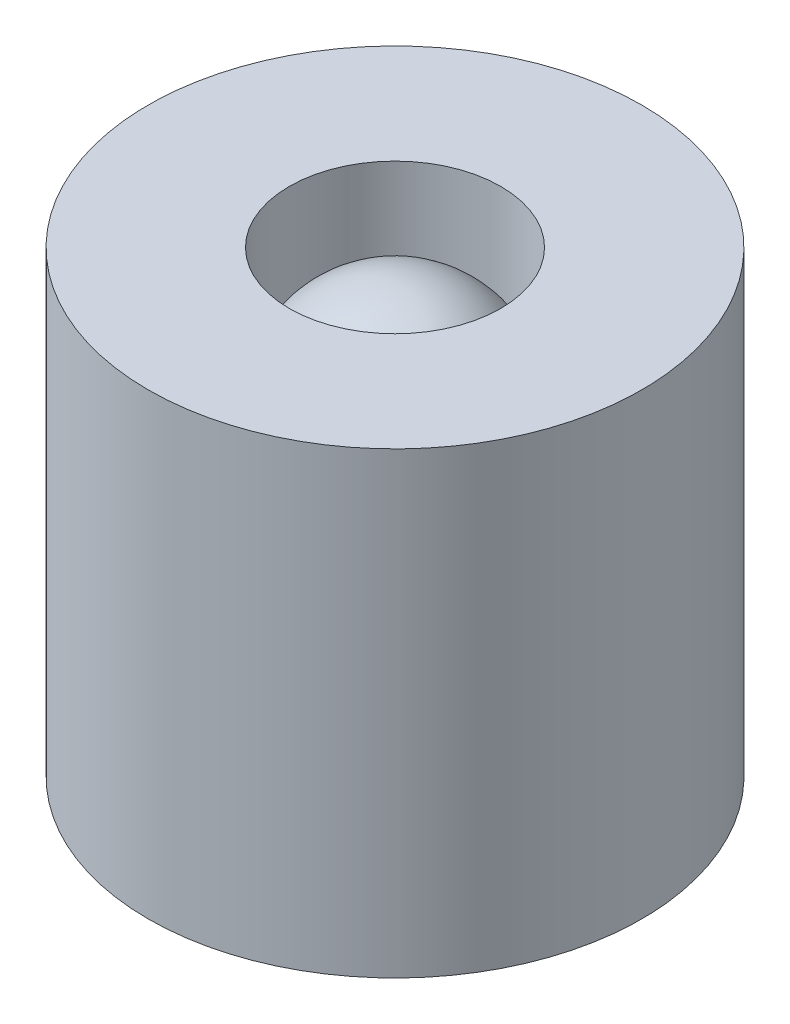
ISO-10303-21;
HEADER;
FILE_DESCRIPTION(('STEP AP214'),'2;1');
FILE_NAME('part.step','',(''),(''),'','','');
FILE_SCHEMA(('AUTOMOTIVE_DESIGN { 1 0 10303 214 1 1 1 1 }'));
ENDSEC;
DATA;
#1=APPLICATION_CONTEXT('core data for automotive mechanical design processes');
#2=APPLICATION_PROTOCOL_DEFINITION('international standard','automotive_design',2000,#1);
#3=PRODUCT_CONTEXT('',#1,'mechanical');
#4=PRODUCT('Part','Part','',(#3));
#5=PRODUCT_RELATED_PRODUCT_CATEGORY('part','',(#4));
#6=PRODUCT_DEFINITION_FORMATION('','',#4);
#7=PRODUCT_DEFINITION_CONTEXT('part definition',#1,'design');
#8=PRODUCT_DEFINITION('design','',#6,#7);
#9=PRODUCT_DEFINITION_SHAPE('','',#8);
#10=(LENGTH_UNIT() NAMED_UNIT(*) SI_UNIT(.MILLI.,.METRE.));
#11=(NAMED_UNIT(*) PLANE_ANGLE_UNIT() SI_UNIT($,.RADIAN.));
#12=(NAMED_UNIT(*) SI_UNIT($,.STERADIAN.) SOLID_ANGLE_UNIT());
#13=UNCERTAINTY_MEASURE_WITH_UNIT(LENGTH_MEASURE(1.E-05),#10,'distance_accuracy_value','');
#14=(GEOMETRIC_REPRESENTATION_CONTEXT(3) GLOBAL_UNCERTAINTY_ASSIGNED_CONTEXT((#13)) GLOBAL_UNIT_ASSIGNED_CONTEXT((#10,
#11,#12)) REPRESENTATION_CONTEXT('',''));
#15=CARTESIAN_POINT('',(0.,0.,0.));
#16=DIRECTION('',(0.,0.,1.));
#17=DIRECTION('',(1.,0.,0.));
#18=AXIS2_PLACEMENT_3D('',#15,#16,#17);
#19=CARTESIAN_POINT('',(0.,6.5,0.));
#20=DIRECTION('',(0.,-1.,0.));
#21=DIRECTION('',(0.,0.,-1.));
#22=AXIS2_PLACEMENT_3D('',#19,#20,#21);
#23=CYLINDRICAL_SURFACE('',#22,1.5);
#24=CARTESIAN_POINT('',(0.,4.10948751620467,0.));
#25=DIRECTION('',(0.,0.999999999999999,0.));
#26=DIRECTION('',(0.,0.,1.));
#27=AXIS2_PLACEMENT_3D('',#24,#25,#26);
#28=CIRCLE('',#27,1.5);
#29=CARTESIAN_POINT('',(0.,4.10948751620467,-1.5));
#30=VERTEX_POINT('',#29);
#31=EDGE_CURVE('E10',#30,#30,#28,.F.);
#32=CARTESIAN_POINT('',(0.,0.,0.));
#33=DIRECTION('',(0.,1.,0.));
#34=DIRECTION('',(0.,0.,1.));
#35=AXIS2_PLACEMENT_3D('',#32,#33,#34);
#36=CIRCLE('',#35,1.5);
#37=CARTESIAN_POINT('',(0.,0.,-1.5));
#38=VERTEX_POINT('',#37);
#39=EDGE_CURVE('E56',#38,#38,#36,.T.);
#40=CARTESIAN_POINT('',(0.,4.10948751620467,-1.5));
#41=CARTESIAN_POINT('',(0.,4.06668035457754,-1.5));
#42=CARTESIAN_POINT('',(0.,4.02387319295041,-1.5));
#43=CARTESIAN_POINT('',(0.,3.93825886969614,-1.5));
#44=CARTESIAN_POINT('',(0.,3.89545170806901,-1.5));
#45=CARTESIAN_POINT('',(0.,3.80983738481475,-1.5));
#46=CARTESIAN_POINT('',(0.,3.76703022318761,-1.5));
#47=CARTESIAN_POINT('',(0.,3.68141589993335,-1.5));
#48=CARTESIAN_POINT('',(0.,3.63860873830622,-1.5));
#49=CARTESIAN_POINT('',(0.,3.55299441505195,-1.5));
#50=CARTESIAN_POINT('',(0.,3.51018725342482,-1.5));
#51=CARTESIAN_POINT('',(0.,3.42457293017056,-1.5));
#52=CARTESIAN_POINT('',(0.,3.38176576854343,-1.5));
#53=CARTESIAN_POINT('',(0.,3.29615144528916,-1.5));
#54=CARTESIAN_POINT('',(0.,3.25334428366203,-1.5));
#55=CARTESIAN_POINT('',(0.,3.16772996040777,-1.5));
#56=CARTESIAN_POINT('',(0.,3.12492279878063,-1.5));
#57=CARTESIAN_POINT('',(0.,3.03930847552637,-1.5));
#58=CARTESIAN_POINT('',(0.,2.99650131389924,-1.5));
#59=CARTESIAN_POINT('',(0.,2.91088699064497,-1.5));
#60=CARTESIAN_POINT('',(0.,2.86807982901784,-1.5));
#61=CARTESIAN_POINT('',(0.,2.78246550576358,-1.5));
#62=CARTESIAN_POINT('',(0.,2.73965834413645,-1.5));
#63=CARTESIAN_POINT('',(0.,2.65404402088218,-1.5));
#64=CARTESIAN_POINT('',(0.,2.61123685925505,-1.5));
#65=CARTESIAN_POINT('',(0.,2.52562253600079,-1.5));
#66=CARTESIAN_POINT('',(0.,2.48281537437365,-1.5));
#67=CARTESIAN_POINT('',(0.,2.39720105111939,-1.5));
#68=CARTESIAN_POINT('',(0.,2.35439388949226,-1.5));
#69=CARTESIAN_POINT('',(0.,2.26877956623799,-1.5));
#70=CARTESIAN_POINT('',(0.,2.22597240461086,-1.5));
#71=CARTESIAN_POINT('',(0.,2.1403580813566,-1.5));
#72=CARTESIAN_POINT('',(0.,2.09755091972947,-1.5));
#73=CARTESIAN_POINT('',(0.,2.0119365964752,-1.5));
#74=CARTESIAN_POINT('',(0.,1.96912943484807,-1.5));
#75=CARTESIAN_POINT('',(0.,1.88351511159381,-1.5));
#76=CARTESIAN_POINT('',(0.,1.84070794996667,-1.5));
#77=CARTESIAN_POINT('',(0.,1.75509362671241,-1.5));
#78=CARTESIAN_POINT('',(0.,1.71228646508528,-1.5));
#79=CARTESIAN_POINT('',(0.,1.62667214183102,-1.5));
#80=CARTESIAN_POINT('',(0.,1.58386498020388,-1.5));
#81=CARTESIAN_POINT('',(0.,1.49825065694962,-1.5));
#82=CARTESIAN_POINT('',(0.,1.45544349532249,-1.5));
#83=CARTESIAN_POINT('',(0.,1.36982917206822,-1.5));
#84=CARTESIAN_POINT('',(0.,1.32702201044109,-1.5));
#85=CARTESIAN_POINT('',(0.,1.24140768718683,-1.5));
#86=CARTESIAN_POINT('',(0.,1.1986005255597,-1.5));
#87=CARTESIAN_POINT('',(0.,1.11298620230543,-1.5));
#88=CARTESIAN_POINT('',(0.,1.0701790406783,-1.5));
#89=CARTESIAN_POINT('',(0.,0.984564717424036,-1.5));
#90=CARTESIAN_POINT('',(0.,0.941757555796903,-1.5));
#91=CARTESIAN_POINT('',(0.,0.856143232542639,-1.5));
#92=CARTESIAN_POINT('',(0.,0.813336070915507,-1.5));
#93=CARTESIAN_POINT('',(0.,0.727721747661243,-1.5));
#94=CARTESIAN_POINT('',(0.,0.684914586034111,-1.5));
#95=CARTESIAN_POINT('',(0.,0.599300262779848,-1.5));
#96=CARTESIAN_POINT('',(0.,0.556493101152716,-1.5));
#97=CARTESIAN_POINT('',(0.,0.470878777898452,-1.5));
#98=CARTESIAN_POINT('',(0.,0.42807161627132,-1.5));
#99=CARTESIAN_POINT('',(0.,0.342457293017056,-1.5));
#100=CARTESIAN_POINT('',(0.,0.299650131389924,-1.5));
#101=CARTESIAN_POINT('',(0.,0.21403580813566,-1.5));
#102=CARTESIAN_POINT('',(0.,0.171228646508528,-1.5));
#103=CARTESIAN_POINT('',(0.,0.0856143232542637,-1.5));
#104=CARTESIAN_POINT('',(0.,0.0428071616271318,-1.5));
#105=CARTESIAN_POINT('',(0.,0.,-1.5));
#106=B_SPLINE_CURVE_WITH_KNOTS('',3,(#40,#41,#42,#43,#44,#45,#46,#47,#48,#49,#50,#51,#52,#53,
#54,#55,#56,#57,#58,#59,#60,#61,#62,#63,#64,#65,#66,#67,#68,#69,#70,#71,#72,#73,#74,#75,#76,#77,
#78,#79,#80,#81,#82,#83,#84,#85,#86,#87,#88,#89,#90,#91,#92,#93,#94,#95,#96,#97,#98,#99,#100,
#101,#102,#103,#104,#105),.UNSPECIFIED.,.F.,.F.,(4,2,2,2,2,2,2,2,2,2,2,2,2,2,2,2,2,2,2,2,2,2,2,
2,2,2,2,2,2,2,2,2,4),(0.,0.128421484881396,0.256842969762792,0.385264454644188,
0.513685939525584,0.64210742440698,0.770528909288376,0.898950394169772,1.02737187905117,
1.15579336393256,1.28421484881396,1.41263633369536,1.54105781857675,1.66947930345815,
1.79790078833954,1.92632227322094,2.05474375810233,2.18316524298373,2.31158672786513,
2.44000821274652,2.56842969762792,2.69685118250931,2.82527266739071,2.95369415227211,
3.0821156371535,3.2105371220349,3.33895860691629,3.46738009179769,3.59580157667909,
3.72422306156048,3.85264454644188,3.98106603132327,4.10948751620467),.UNSPECIFIED.);
#107=EDGE_CURVE('BSEAM35',#30,#38,#106,.T.);
#108=ORIENTED_EDGE('',*,*,#31,.F.);
#109=ORIENTED_EDGE('',*,*,#39,.F.);
#110=ORIENTED_EDGE('',*,*,#107,.T.);
#111=ORIENTED_EDGE('',*,*,#107,.F.);
#112=EDGE_LOOP('',(#108,#110,#109,#111));
#113=FACE_BOUND('',#112,.T.);
#114=ADVANCED_FACE('F35',(#113),#23,.F.);
#115=CARTESIAN_POINT('',(0.,6.5,0.));
#116=DIRECTION('',(0.,1.,0.));
#117=DIRECTION('',(0.,0.,1.));
#118=AXIS2_PLACEMENT_3D('',#115,#116,#117);
#119=PLANE('',#118);
#120=CARTESIAN_POINT('',(0.,6.5,0.));
#121=DIRECTION('',(0.,1.,0.));
#122=DIRECTION('',(0.,0.,1.));
#123=AXIS2_PLACEMENT_3D('',#120,#121,#122);
#124=CIRCLE('',#123,3.5);
#125=CARTESIAN_POINT('',(0.,6.5,-3.5));
#126=VERTEX_POINT('',#125);
#127=EDGE_CURVE('E46',#126,#126,#124,.T.);
#128=ORIENTED_EDGE('',*,*,#127,.T.);
#129=EDGE_LOOP('',(#128));
#130=FACE_BOUND('',#129,.T.);
#131=CARTESIAN_POINT('',(0.,6.5,0.));
#132=DIRECTION('',(0.,1.,0.));
#133=DIRECTION('',(0.,0.,1.));
#134=AXIS2_PLACEMENT_3D('',#131,#132,#133);
#135=CIRCLE('',#134,1.5);
#136=CARTESIAN_POINT('',(0.,6.5,-1.5));
#137=VERTEX_POINT('',#136);
#138=EDGE_CURVE('E54',#137,#137,#135,.T.);
#139=ORIENTED_EDGE('',*,*,#138,.F.);
#140=EDGE_LOOP('',(#139));
#141=FACE_BOUND('',#140,.T.);
#142=ADVANCED_FACE('F64',(#130,#141),#119,.T.);
#143=CARTESIAN_POINT('',(0.,0.,0.));
#144=DIRECTION('',(0.,1.,0.));
#145=DIRECTION('',(0.,0.,1.));
#146=AXIS2_PLACEMENT_3D('',#143,#144,#145);
#147=PLANE('',#146);
#148=CARTESIAN_POINT('',(0.,0.,0.));
#149=DIRECTION('',(0.,1.,0.));
#150=DIRECTION('',(0.,0.,1.));
#151=AXIS2_PLACEMENT_3D('',#148,#149,#150);
#152=CIRCLE('',#151,3.5);
#153=CARTESIAN_POINT('',(0.,0.,-3.5));
#154=VERTEX_POINT('',#153);
#155=EDGE_CURVE('E50',#154,#154,#152,.T.);
#156=ORIENTED_EDGE('',*,*,#155,.F.);
#157=EDGE_LOOP('',(#156));
#158=FACE_BOUND('',#157,.T.);
#159=ORIENTED_EDGE('',*,*,#39,.T.);
#160=EDGE_LOOP('',(#159));
#161=FACE_BOUND('',#160,.T.);
#162=ADVANCED_FACE('F66',(#158,#161),#147,.F.);
#163=CARTESIAN_POINT('',(0.,6.5,0.));
#164=DIRECTION('',(0.,-1.,0.));
#165=DIRECTION('',(0.,0.,-1.));
#166=AXIS2_PLACEMENT_3D('',#163,#164,#165);
#167=CYLINDRICAL_SURFACE('',#166,3.5);
#168=CARTESIAN_POINT('',(0.,6.5,-3.5));
#169=CARTESIAN_POINT('',(0.,6.43229166666667,-3.5));
#170=CARTESIAN_POINT('',(0.,6.36458333333333,-3.5));
#171=CARTESIAN_POINT('',(0.,6.22916666666667,-3.5));
#172=CARTESIAN_POINT('',(0.,6.16145833333333,-3.5));
#173=CARTESIAN_POINT('',(0.,6.02604166666667,-3.5));
#174=CARTESIAN_POINT('',(0.,5.95833333333333,-3.5));
#175=CARTESIAN_POINT('',(0.,5.82291666666667,-3.5));
#176=CARTESIAN_POINT('',(0.,5.75520833333333,-3.5));
#177=CARTESIAN_POINT('',(0.,5.61979166666667,-3.5));
#178=CARTESIAN_POINT('',(0.,5.55208333333333,-3.5));
#179=CARTESIAN_POINT('',(0.,5.41666666666667,-3.5));
#180=CARTESIAN_POINT('',(0.,5.34895833333333,-3.5));
#181=CARTESIAN_POINT('',(0.,5.21354166666667,-3.5));
#182=CARTESIAN_POINT('',(0.,5.14583333333333,-3.5));
#183=CARTESIAN_POINT('',(0.,5.01041666666667,-3.5));
#184=CARTESIAN_POINT('',(0.,4.94270833333333,-3.5));
#185=CARTESIAN_POINT('',(0.,4.80729166666667,-3.5));
#186=CARTESIAN_POINT('',(0.,4.73958333333333,-3.5));
#187=CARTESIAN_POINT('',(0.,4.60416666666667,-3.5));
#188=CARTESIAN_POINT('',(0.,4.53645833333333,-3.5));
#189=CARTESIAN_POINT('',(0.,4.40104166666667,-3.5));
#190=CARTESIAN_POINT('',(0.,4.33333333333333,-3.5));
#191=CARTESIAN_POINT('',(0.,4.19791666666667,-3.5));
#192=CARTESIAN_POINT('',(0.,4.13020833333333,-3.5));
#193=CARTESIAN_POINT('',(0.,3.99479166666667,-3.5));
#194=CARTESIAN_POINT('',(0.,3.92708333333333,-3.5));
#195=CARTESIAN_POINT('',(0.,3.79166666666667,-3.5));
#196=CARTESIAN_POINT('',(0.,3.72395833333333,-3.5));
#197=CARTESIAN_POINT('',(0.,3.58854166666667,-3.5));
#198=CARTESIAN_POINT('',(0.,3.52083333333333,-3.5));
#199=CARTESIAN_POINT('',(0.,3.38541666666667,-3.5));
#200=CARTESIAN_POINT('',(0.,3.31770833333333,-3.5));
#201=CARTESIAN_POINT('',(0.,3.18229166666667,-3.5));
#202=CARTESIAN_POINT('',(0.,3.11458333333333,-3.5));
#203=CARTESIAN_POINT('',(0.,2.97916666666667,-3.5));
#204=CARTESIAN_POINT('',(0.,2.91145833333333,-3.5));
#205=CARTESIAN_POINT('',(0.,2.77604166666667,-3.5));
#206=CARTESIAN_POINT('',(0.,2.70833333333333,-3.5));
#207=CARTESIAN_POINT('',(0.,2.57291666666667,-3.5));
#208=CARTESIAN_POINT('',(0.,2.50520833333333,-3.5));
#209=CARTESIAN_POINT('',(0.,2.36979166666667,-3.5));
#210=CARTESIAN_POINT('',(0.,2.30208333333333,-3.5));
#211=CARTESIAN_POINT('',(0.,2.16666666666667,-3.5));
#212=CARTESIAN_POINT('',(0.,2.09895833333333,-3.5));
#213=CARTESIAN_POINT('',(0.,1.96354166666667,-3.5));
#214=CARTESIAN_POINT('',(0.,1.89583333333333,-3.5));
#215=CARTESIAN_POINT('',(0.,1.76041666666667,-3.5));
#216=CARTESIAN_POINT('',(0.,1.69270833333333,-3.5));
#217=CARTESIAN_POINT('',(0.,1.55729166666667,-3.5));
#218=CARTESIAN_POINT('',(0.,1.48958333333333,-3.5));
#219=CARTESIAN_POINT('',(0.,1.35416666666667,-3.5));
#220=CARTESIAN_POINT('',(0.,1.28645833333333,-3.5));
#221=CARTESIAN_POINT('',(0.,1.15104166666667,-3.5));
#222=CARTESIAN_POINT('',(0.,1.08333333333333,-3.5));
#223=CARTESIAN_POINT('',(0.,0.947916666666667,-3.5));
#224=CARTESIAN_POINT('',(0.,0.880208333333333,-3.5));
#225=CARTESIAN_POINT('',(0.,0.744791666666667,-3.5));
#226=CARTESIAN_POINT('',(0.,0.677083333333333,-3.5));
#227=CARTESIAN_POINT('',(0.,0.541666666666667,-3.5));
#228=CARTESIAN_POINT('',(0.,0.473958333333333,-3.5));
#229=CARTESIAN_POINT('',(0.,0.338541666666667,-3.5));
#230=CARTESIAN_POINT('',(0.,0.270833333333334,-3.5));
#231=CARTESIAN_POINT('',(0.,0.135416666666667,-3.5));
#232=CARTESIAN_POINT('',(0.,0.0677083333333334,-3.5));
#233=CARTESIAN_POINT('',(0.,0.,-3.5));
#234=B_SPLINE_CURVE_WITH_KNOTS('',3,(#168,#169,#170,#171,#172,#173,#174,#175,#176,#177,#178,
#179,#180,#181,#182,#183,#184,#185,#186,#187,#188,#189,#190,#191,#192,#193,#194,#195,#196,#197,
#198,#199,#200,#201,#202,#203,#204,#205,#206,#207,#208,#209,#210,#211,#212,#213,#214,#215,#216,
#217,#218,#219,#220,#221,#222,#223,#224,#225,#226,#227,#228,#229,#230,#231,#232,#233),
.UNSPECIFIED.,.F.,.F.,(4,2,2,2,2,2,2,2,2,2,2,2,2,2,2,2,2,2,2,2,2,2,2,2,2,2,2,2,2,2,2,2,4),(0.,
0.203124999999999,0.40625,0.609375,0.812499999999999,1.015625,1.21875,1.421875,1.625,1.828125,
2.03125,2.234375,2.4375,2.640625,2.84375,3.046875,3.25,3.453125,3.65625,3.859375,4.0625,
4.265625,4.46875,4.671875,4.875,5.078125,5.28125,5.484375,5.6875,5.890625,6.09375,6.296875,6.5),.UNSPECIFIED.);
#235=EDGE_CURVE('BSEAM37',#126,#154,#234,.T.);
#236=ORIENTED_EDGE('',*,*,#127,.F.);
#237=ORIENTED_EDGE('',*,*,#155,.T.);
#238=ORIENTED_EDGE('',*,*,#235,.T.);
#239=ORIENTED_EDGE('',*,*,#235,.F.);
#240=EDGE_LOOP('',(#236,#238,#237,#239));
#241=FACE_BOUND('',#240,.T.);
#242=ADVANCED_FACE('F37',(#241),#167,.T.);
#243=CARTESIAN_POINT('',(0.,4.89051248379533,0.));
#244=DIRECTION('',(0.,-0.999999999999999,0.));
#245=DIRECTION('',(0.,0.,-1.));
#246=AXIS2_PLACEMENT_3D('',#243,#244,#245);
#247=CIRCLE('',#246,1.5);
#248=CARTESIAN_POINT('',(0.,4.89051248379533,-1.5));
#249=VERTEX_POINT('',#248);
#250=EDGE_CURVE('E42',#249,#249,#247,.F.);
#251=CARTESIAN_POINT('',(0.,4.89051248379533,-1.5));
#252=CARTESIAN_POINT('',(0.,4.9072779787558,-1.5));
#253=CARTESIAN_POINT('',(0.,4.92404347371626,-1.5));
#254=CARTESIAN_POINT('',(0.,4.95757446363719,-1.5));
#255=CARTESIAN_POINT('',(0.,4.97433995859766,-1.5));
#256=CARTESIAN_POINT('',(0.,5.00787094851859,-1.5));
#257=CARTESIAN_POINT('',(0.,5.02463644347905,-1.5));
#258=CARTESIAN_POINT('',(0.,5.05816743339999,-1.5));
#259=CARTESIAN_POINT('',(0.,5.07493292836045,-1.5));
#260=CARTESIAN_POINT('',(0.,5.10846391828138,-1.5));
#261=CARTESIAN_POINT('',(0.,5.12522941324185,-1.5));
#262=CARTESIAN_POINT('',(0.,5.15876040316278,-1.5));
#263=CARTESIAN_POINT('',(0.,5.17552589812324,-1.5));
#264=CARTESIAN_POINT('',(0.,5.20905688804417,-1.5));
#265=CARTESIAN_POINT('',(0.,5.22582238300464,-1.5));
#266=CARTESIAN_POINT('',(0.,5.25935337292557,-1.5));
#267=CARTESIAN_POINT('',(0.,5.27611886788603,-1.5));
#268=CARTESIAN_POINT('',(0.,5.30964985780696,-1.5));
#269=CARTESIAN_POINT('',(0.,5.32641535276743,-1.5));
#270=CARTESIAN_POINT('',(0.,5.35994634268836,-1.5));
#271=CARTESIAN_POINT('',(0.,5.37671183764883,-1.5));
#272=CARTESIAN_POINT('',(0.,5.41024282756976,-1.5));
#273=CARTESIAN_POINT('',(0.,5.42700832253022,-1.5));
#274=CARTESIAN_POINT('',(0.,5.46053931245115,-1.5));
#275=CARTESIAN_POINT('',(0.,5.47730480741162,-1.5));
#276=CARTESIAN_POINT('',(0.,5.51083579733255,-1.5));
#277=CARTESIAN_POINT('',(0.,5.52760129229301,-1.5));
#278=CARTESIAN_POINT('',(0.,5.56113228221394,-1.5));
#279=CARTESIAN_POINT('',(0.,5.57789777717441,-1.5));
#280=CARTESIAN_POINT('',(0.,5.61142876709534,-1.5));
#281=CARTESIAN_POINT('',(0.,5.6281942620558,-1.5));
#282=CARTESIAN_POINT('',(0.,5.66172525197674,-1.5));
#283=CARTESIAN_POINT('',(0.,5.6784907469372,-1.5));
#284=CARTESIAN_POINT('',(0.,5.71202173685813,-1.5));
#285=CARTESIAN_POINT('',(0.,5.7287872318186,-1.5));
#286=CARTESIAN_POINT('',(0.,5.76231822173953,-1.5));
#287=CARTESIAN_POINT('',(0.,5.77908371669999,-1.5));
#288=CARTESIAN_POINT('',(0.,5.81261470662092,-1.5));
#289=CARTESIAN_POINT('',(0.,5.82938020158139,-1.5));
#290=CARTESIAN_POINT('',(0.,5.86291119150232,-1.5));
#291=CARTESIAN_POINT('',(0.,5.87967668646278,-1.5));
#292=CARTESIAN_POINT('',(0.,5.91320767638371,-1.5));
#293=CARTESIAN_POINT('',(0.,5.92997317134418,-1.5));
#294=CARTESIAN_POINT('',(0.,5.96350416126511,-1.5));
#295=CARTESIAN_POINT('',(0.,5.98026965622558,-1.5));
#296=CARTESIAN_POINT('',(0.,6.01380064614651,-1.5));
#297=CARTESIAN_POINT('',(0.,6.03056614110697,-1.5));
#298=CARTESIAN_POINT('',(0.,6.0640971310279,-1.5));
#299=CARTESIAN_POINT('',(0.,6.08086262598837,-1.5));
#300=CARTESIAN_POINT('',(0.,6.1143936159093,-1.5));
#301=CARTESIAN_POINT('',(0.,6.13115911086976,-1.5));
#302=CARTESIAN_POINT('',(0.,6.16469010079069,-1.5));
#303=CARTESIAN_POINT('',(0.,6.18145559575116,-1.5));
#304=CARTESIAN_POINT('',(0.,6.21498658567209,-1.5));
#305=CARTESIAN_POINT('',(0.,6.23175208063255,-1.5));
#306=CARTESIAN_POINT('',(0.,6.26528307055348,-1.5));
#307=CARTESIAN_POINT('',(0.,6.28204856551395,-1.5));
#308=CARTESIAN_POINT('',(0.,6.31557955543488,-1.5));
#309=CARTESIAN_POINT('',(0.,6.33234505039535,-1.5));
#310=CARTESIAN_POINT('',(0.,6.36587604031628,-1.5));
#311=CARTESIAN_POINT('',(0.,6.38264153527674,-1.5));
#312=CARTESIAN_POINT('',(0.,6.41617252519767,-1.5));
#313=CARTESIAN_POINT('',(0.,6.43293802015814,-1.5));
#314=CARTESIAN_POINT('',(0.,6.46646901007907,-1.5));
#315=CARTESIAN_POINT('',(0.,6.48323450503953,-1.5));
#316=CARTESIAN_POINT('',(0.,6.5,-1.5));
#317=B_SPLINE_CURVE_WITH_KNOTS('',3,(#251,#252,#253,#254,#255,#256,#257,#258,#259,#260,#261,
#262,#263,#264,#265,#266,#267,#268,#269,#270,#271,#272,#273,#274,#275,#276,#277,#278,#279,#280,
#281,#282,#283,#284,#285,#286,#287,#288,#289,#290,#291,#292,#293,#294,#295,#296,#297,#298,#299,
#300,#301,#302,#303,#304,#305,#306,#307,#308,#309,#310,#311,#312,#313,#314,#315,#316),
.UNSPECIFIED.,.F.,.F.,(4,2,2,2,2,2,2,2,2,2,2,2,2,2,2,2,2,2,2,2,2,2,2,2,2,2,2,2,2,2,2,2,4),(0.,
0.0502964848813955,0.100592969762792,0.150889454644187,0.201185939525583,0.251482424406979,
0.301778909288375,0.352075394169771,0.402371879051166,0.452668363932563,0.502964848813958,
0.553261333695355,0.60355781857675,0.653854303458145,0.704150788339542,0.754447273220937,
0.804743758102334,0.855040242983729,0.905336727865125,0.955633212746521,1.00592969762792,
1.05622618250931,1.10652266739071,1.1568191522721,1.2071156371535,1.2574121220349,
1.30770860691629,1.35800509179769,1.40830157667908,1.45859806156048,1.50889454644188,
1.55919103132327,1.60948751620467),.UNSPECIFIED.);
#318=EDGE_CURVE('BSEAM62',#249,#137,#317,.T.);
#319=ORIENTED_EDGE('',*,*,#250,.F.);
#320=ORIENTED_EDGE('',*,*,#138,.T.);
#321=ORIENTED_EDGE('',*,*,#318,.T.);
#322=ORIENTED_EDGE('',*,*,#318,.F.);
#323=EDGE_LOOP('',(#319,#321,#320,#322));
#324=FACE_BOUND('',#323,.T.);
#325=ADVANCED_FACE('F62',(#324),#23,.F.);
#326=CARTESIAN_POINT('',(0.,4.5,0.));
#327=DIRECTION('',(-1.,0.,0.));
#328=DIRECTION('',(0.,0.,-1.));
#329=AXIS2_PLACEMENT_3D('',#326,#327,#328);
#330=SPHERICAL_SURFACE('',#329,1.55);
#331=CARTESIAN_POINT('',(0.,4.5,0.));
#332=DIRECTION('',(0.,-1.,0.));
#333=DIRECTION('',(0.,0.,-1.));
#334=AXIS2_PLACEMENT_3D('',#331,#332,#333);
#335=SPHERICAL_SURFACE('',#334,1.55);
#336=ORIENTED_EDGE('',*,*,#250,.T.);
#337=EDGE_LOOP('',(#336));
#338=FACE_BOUND('',#337,.T.);
#339=ADVANCED_FACE('F78',(#338),#335,.T.);
#340=CARTESIAN_POINT('',(0.,4.5,0.));
#341=DIRECTION('',(0.,1.,0.));
#342=DIRECTION('',(0.,0.,1.));
#343=AXIS2_PLACEMENT_3D('',#340,#341,#342);
#344=SPHERICAL_SURFACE('',#343,1.55);
#345=ORIENTED_EDGE('',*,*,#31,.T.);
#346=EDGE_LOOP('',(#345));
#347=FACE_BOUND('',#346,.T.);
#348=ADVANCED_FACE('F81',(#347),#344,.T.);
#349=CLOSED_SHELL('',(#114,#142,#162,#242,#325,#339,#348));
#350=MANIFOLD_SOLID_BREP('B2',#349);
#351=ADVANCED_BREP_SHAPE_REPRESENTATION('',(#18,#350),#14);
#352=SHAPE_DEFINITION_REPRESENTATION(#9,#351);
ENDSEC;
END-ISO-10303-21;
